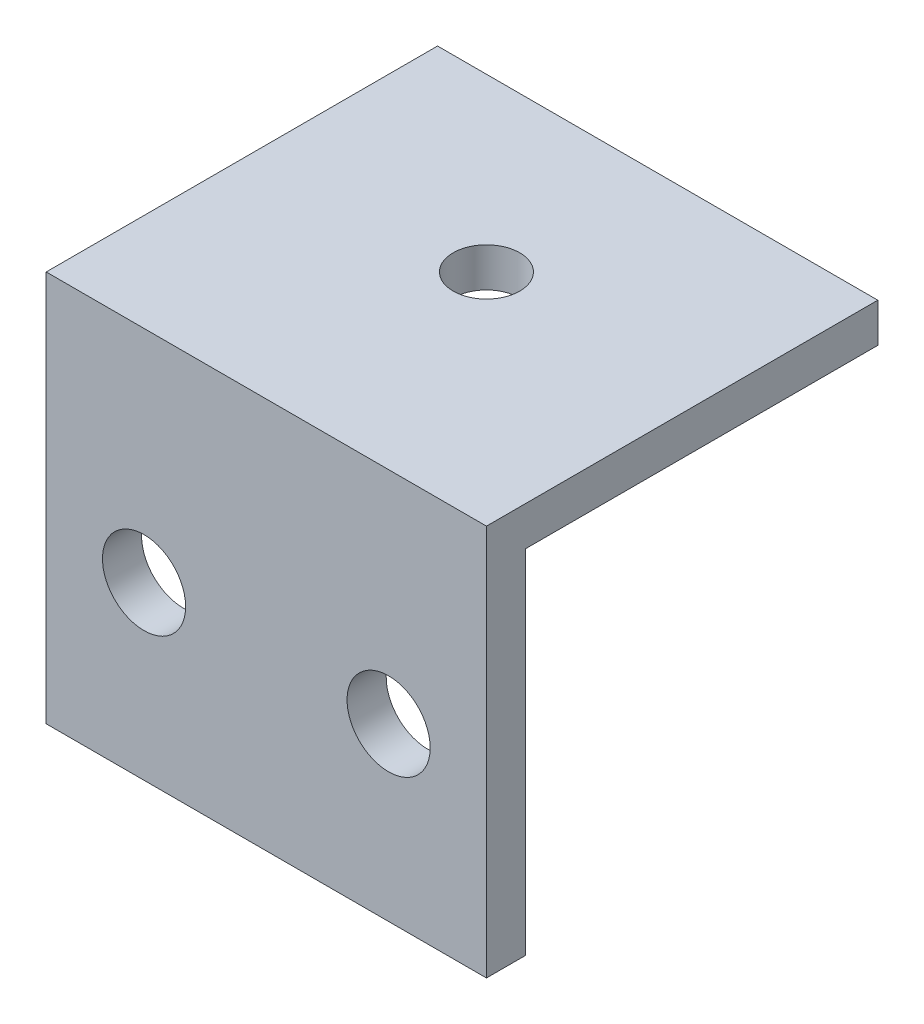
ISO-10303-21;
HEADER;
FILE_DESCRIPTION(('STEP AP214'),'2;1');
FILE_NAME('part.step','',(''),(''),'','','');
FILE_SCHEMA(('AUTOMOTIVE_DESIGN { 1 0 10303 214 1 1 1 1 }'));
ENDSEC;
DATA;
#1=APPLICATION_CONTEXT('core data for automotive mechanical design processes');
#2=APPLICATION_PROTOCOL_DEFINITION('international standard','automotive_design',2000,#1);
#3=PRODUCT_CONTEXT('',#1,'mechanical');
#4=PRODUCT('Part','Part','',(#3));
#5=PRODUCT_RELATED_PRODUCT_CATEGORY('part','',(#4));
#6=PRODUCT_DEFINITION_FORMATION('','',#4);
#7=PRODUCT_DEFINITION_CONTEXT('part definition',#1,'design');
#8=PRODUCT_DEFINITION('design','',#6,#7);
#9=PRODUCT_DEFINITION_SHAPE('','',#8);
#10=(LENGTH_UNIT() NAMED_UNIT(*) SI_UNIT(.MILLI.,.METRE.));
#11=(NAMED_UNIT(*) PLANE_ANGLE_UNIT() SI_UNIT($,.RADIAN.));
#12=(NAMED_UNIT(*) SI_UNIT($,.STERADIAN.) SOLID_ANGLE_UNIT());
#13=UNCERTAINTY_MEASURE_WITH_UNIT(LENGTH_MEASURE(1.E-05),#10,'distance_accuracy_value','');
#14=(GEOMETRIC_REPRESENTATION_CONTEXT(3) GLOBAL_UNCERTAINTY_ASSIGNED_CONTEXT((#13)) GLOBAL_UNIT_ASSIGNED_CONTEXT((#10,
#11,#12)) REPRESENTATION_CONTEXT('',''));
#15=CARTESIAN_POINT('',(0.,0.,0.));
#16=DIRECTION('',(0.,0.,1.));
#17=DIRECTION('',(1.,0.,0.));
#18=AXIS2_PLACEMENT_3D('',#15,#16,#17);
#19=CARTESIAN_POINT('',(22.5,-40.,-4.));
#20=DIRECTION('',(0.,1.,0.));
#21=DIRECTION('',(0.,0.,1.));
#22=AXIS2_PLACEMENT_3D('',#19,#20,#21);
#23=PLANE('',#22);
#24=DIRECTION('',(0.,0.,-1.));
#25=VECTOR('',#24,1.);
#26=CARTESIAN_POINT('',(-22.5,-40.,-4.));
#27=LINE('',#26,#25);
#28=CARTESIAN_POINT('',(-22.5,-40.,0.));
#29=VERTEX_POINT('',#28);
#30=CARTESIAN_POINT('',(-22.5,-40.,-4.));
#31=VERTEX_POINT('',#30);
#32=EDGE_CURVE('E123',#29,#31,#27,.T.);
#33=ORIENTED_EDGE('',*,*,#32,.T.);
#34=DIRECTION('',(-1.,0.,0.));
#35=VECTOR('',#34,1.);
#36=CARTESIAN_POINT('',(22.5,-40.,-4.));
#37=LINE('',#36,#35);
#38=CARTESIAN_POINT('',(22.5,-40.,-4.));
#39=VERTEX_POINT('',#38);
#40=EDGE_CURVE('E11',#39,#31,#37,.T.);
#41=ORIENTED_EDGE('',*,*,#40,.F.);
#42=DIRECTION('',(0.,0.,-1.));
#43=VECTOR('',#42,1.);
#44=CARTESIAN_POINT('',(22.5,-40.,-4.));
#45=LINE('',#44,#43);
#46=CARTESIAN_POINT('',(22.5,-40.,0.));
#47=VERTEX_POINT('',#46);
#48=EDGE_CURVE('E134',#47,#39,#45,.T.);
#49=ORIENTED_EDGE('',*,*,#48,.F.);
#50=DIRECTION('',(-1.,0.,0.));
#51=VECTOR('',#50,1.);
#52=CARTESIAN_POINT('',(22.5,-40.,0.));
#53=LINE('',#52,#51);
#54=EDGE_CURVE('E119',#47,#29,#53,.T.);
#55=ORIENTED_EDGE('',*,*,#54,.T.);
#56=EDGE_LOOP('',(#33,#41,#49,#55));
#57=FACE_BOUND('',#56,.T.);
#58=ADVANCED_FACE('F39',(#57),#23,.F.);
#59=CARTESIAN_POINT('',(22.5,-4.00000000000001,-4.));
#60=DIRECTION('',(0.,0.,1.));
#61=DIRECTION('',(0.,-1.,0.));
#62=AXIS2_PLACEMENT_3D('',#59,#60,#61);
#63=PLANE('',#62);
#64=CARTESIAN_POINT('',(-12.5,-22.5,-4.));
#65=DIRECTION('',(0.,0.,1.));
#66=DIRECTION('',(0.,-1.,0.));
#67=AXIS2_PLACEMENT_3D('',#64,#65,#66);
#68=CIRCLE('',#67,4.24999999999999);
#69=CARTESIAN_POINT('',(-12.5,-26.75,-4.));
#70=VERTEX_POINT('',#69);
#71=EDGE_CURVE('E261',#70,#70,#68,.T.);
#72=ORIENTED_EDGE('',*,*,#71,.T.);
#73=EDGE_LOOP('',(#72));
#74=FACE_BOUND('',#73,.T.);
#75=CARTESIAN_POINT('',(12.5,-22.5,-4.));
#76=DIRECTION('',(0.,0.,1.));
#77=DIRECTION('',(0.,-1.,0.));
#78=AXIS2_PLACEMENT_3D('',#75,#76,#77);
#79=CIRCLE('',#78,4.24999999999999);
#80=CARTESIAN_POINT('',(12.5,-26.75,-4.));
#81=VERTEX_POINT('',#80);
#82=EDGE_CURVE('E265',#81,#81,#79,.T.);
#83=ORIENTED_EDGE('',*,*,#82,.T.);
#84=EDGE_LOOP('',(#83));
#85=FACE_BOUND('',#84,.T.);
#86=DIRECTION('',(0.,1.,0.));
#87=VECTOR('',#86,1.);
#88=CARTESIAN_POINT('',(-22.5,-4.00000000000001,-4.));
#89=LINE('',#88,#87);
#90=CARTESIAN_POINT('',(-22.5,-4.00000000000001,-4.));
#91=VERTEX_POINT('',#90);
#92=EDGE_CURVE('E126',#31,#91,#89,.T.);
#93=ORIENTED_EDGE('',*,*,#92,.T.);
#94=DIRECTION('',(-1.,0.,0.));
#95=VECTOR('',#94,1.);
#96=CARTESIAN_POINT('',(22.5,-4.00000000000001,-4.));
#97=LINE('',#96,#95);
#98=CARTESIAN_POINT('',(22.5,-4.00000000000001,-4.));
#99=VERTEX_POINT('',#98);
#100=EDGE_CURVE('E47',#99,#91,#97,.T.);
#101=ORIENTED_EDGE('',*,*,#100,.F.);
#102=DIRECTION('',(0.,1.,0.));
#103=VECTOR('',#102,1.);
#104=CARTESIAN_POINT('',(22.5,-4.00000000000001,-4.));
#105=LINE('',#104,#103);
#106=EDGE_CURVE('E92',#39,#99,#105,.T.);
#107=ORIENTED_EDGE('',*,*,#106,.F.);
#108=ORIENTED_EDGE('',*,*,#40,.T.);
#109=EDGE_LOOP('',(#93,#101,#107,#108));
#110=FACE_BOUND('',#109,.T.);
#111=ADVANCED_FACE('F162',(#74,#85,#110),#63,.F.);
#112=CARTESIAN_POINT('',(22.5,-4.,-40.));
#113=DIRECTION('',(0.,1.,0.));
#114=DIRECTION('',(0.,0.,1.));
#115=AXIS2_PLACEMENT_3D('',#112,#113,#114);
#116=PLANE('',#115);
#117=CARTESIAN_POINT('',(0.,-4.,-22.5));
#118=DIRECTION('',(0.,1.,0.));
#119=DIRECTION('',(0.,0.,1.));
#120=AXIS2_PLACEMENT_3D('',#117,#118,#119);
#121=CIRCLE('',#120,3.39999999999999);
#122=CARTESIAN_POINT('',(0.,-4.,-19.1));
#123=VERTEX_POINT('',#122);
#124=EDGE_CURVE('E127',#123,#123,#121,.T.);
#125=ORIENTED_EDGE('',*,*,#124,.T.);
#126=EDGE_LOOP('',(#125));
#127=FACE_BOUND('',#126,.T.);
#128=DIRECTION('',(0.,0.,-1.));
#129=VECTOR('',#128,1.);
#130=CARTESIAN_POINT('',(-22.5,-4.,-40.));
#131=LINE('',#130,#129);
#132=CARTESIAN_POINT('',(-22.5,-4.,-40.));
#133=VERTEX_POINT('',#132);
#134=EDGE_CURVE('E129',#91,#133,#131,.T.);
#135=ORIENTED_EDGE('',*,*,#134,.T.);
#136=DIRECTION('',(-1.,0.,0.));
#137=VECTOR('',#136,1.);
#138=CARTESIAN_POINT('',(22.5,-4.,-40.));
#139=LINE('',#138,#137);
#140=CARTESIAN_POINT('',(22.5,-4.,-40.));
#141=VERTEX_POINT('',#140);
#142=EDGE_CURVE('E114',#141,#133,#139,.T.);
#143=ORIENTED_EDGE('',*,*,#142,.F.);
#144=DIRECTION('',(0.,0.,-1.));
#145=VECTOR('',#144,1.);
#146=CARTESIAN_POINT('',(22.5,-4.,-40.));
#147=LINE('',#146,#145);
#148=EDGE_CURVE('E105',#99,#141,#147,.T.);
#149=ORIENTED_EDGE('',*,*,#148,.F.);
#150=ORIENTED_EDGE('',*,*,#100,.T.);
#151=EDGE_LOOP('',(#135,#143,#149,#150));
#152=FACE_BOUND('',#151,.T.);
#153=ADVANCED_FACE('F140',(#127,#152),#116,.F.);
#154=CARTESIAN_POINT('',(22.5,0.,-40.));
#155=DIRECTION('',(0.,0.,1.));
#156=DIRECTION('',(1.,0.,0.));
#157=AXIS2_PLACEMENT_3D('',#154,#155,#156);
#158=PLANE('',#157);
#159=DIRECTION('',(0.,1.,0.));
#160=VECTOR('',#159,1.);
#161=CARTESIAN_POINT('',(-22.5,0.,-40.));
#162=LINE('',#161,#160);
#163=CARTESIAN_POINT('',(-22.5,0.,-40.));
#164=VERTEX_POINT('',#163);
#165=EDGE_CURVE('E113',#133,#164,#162,.T.);
#166=ORIENTED_EDGE('',*,*,#165,.T.);
#167=DIRECTION('',(-1.,0.,0.));
#168=VECTOR('',#167,1.);
#169=CARTESIAN_POINT('',(22.5,0.,-40.));
#170=LINE('',#169,#168);
#171=CARTESIAN_POINT('',(22.5,0.,-40.));
#172=VERTEX_POINT('',#171);
#173=EDGE_CURVE('E110',#172,#164,#170,.T.);
#174=ORIENTED_EDGE('',*,*,#173,.F.);
#175=DIRECTION('',(0.,1.,0.));
#176=VECTOR('',#175,1.);
#177=CARTESIAN_POINT('',(22.5,0.,-40.));
#178=LINE('',#177,#176);
#179=EDGE_CURVE('E99',#141,#172,#178,.T.);
#180=ORIENTED_EDGE('',*,*,#179,.F.);
#181=ORIENTED_EDGE('',*,*,#142,.T.);
#182=EDGE_LOOP('',(#166,#174,#180,#181));
#183=FACE_BOUND('',#182,.T.);
#184=ADVANCED_FACE('F111',(#183),#158,.F.);
#185=CARTESIAN_POINT('',(22.5,0.,0.));
#186=DIRECTION('',(0.,-1.,0.));
#187=DIRECTION('',(0.,0.,-1.));
#188=AXIS2_PLACEMENT_3D('',#185,#186,#187);
#189=PLANE('',#188);
#190=CARTESIAN_POINT('',(0.,0.,-22.5));
#191=DIRECTION('',(0.,1.,0.));
#192=DIRECTION('',(0.,0.,1.));
#193=AXIS2_PLACEMENT_3D('',#190,#191,#192);
#194=CIRCLE('',#193,3.4);
#195=CARTESIAN_POINT('',(0.,0.,-19.1));
#196=VERTEX_POINT('',#195);
#197=EDGE_CURVE('E271',#196,#196,#194,.T.);
#198=ORIENTED_EDGE('',*,*,#197,.F.);
#199=EDGE_LOOP('',(#198));
#200=FACE_BOUND('',#199,.T.);
#201=DIRECTION('',(0.,0.,1.));
#202=VECTOR('',#201,1.);
#203=CARTESIAN_POINT('',(-22.5,0.,0.));
#204=LINE('',#203,#202);
#205=CARTESIAN_POINT('',(-22.5,0.,0.));
#206=VERTEX_POINT('',#205);
#207=EDGE_CURVE('E78',#164,#206,#204,.T.);
#208=ORIENTED_EDGE('',*,*,#207,.T.);
#209=DIRECTION('',(-1.,0.,0.));
#210=VECTOR('',#209,1.);
#211=CARTESIAN_POINT('',(22.5,0.,0.));
#212=LINE('',#211,#210);
#213=CARTESIAN_POINT('',(22.5,0.,0.));
#214=VERTEX_POINT('',#213);
#215=EDGE_CURVE('E115',#214,#206,#212,.T.);
#216=ORIENTED_EDGE('',*,*,#215,.F.);
#217=DIRECTION('',(0.,0.,1.));
#218=VECTOR('',#217,1.);
#219=CARTESIAN_POINT('',(22.5,0.,0.));
#220=LINE('',#219,#218);
#221=EDGE_CURVE('E103',#172,#214,#220,.T.);
#222=ORIENTED_EDGE('',*,*,#221,.F.);
#223=ORIENTED_EDGE('',*,*,#173,.T.);
#224=EDGE_LOOP('',(#208,#216,#222,#223));
#225=FACE_BOUND('',#224,.T.);
#226=ADVANCED_FACE('F117',(#200,#225),#189,.F.);
#227=CARTESIAN_POINT('',(22.5,-40.,0.));
#228=DIRECTION('',(0.,0.,-1.));
#229=DIRECTION('',(-1.,0.,0.));
#230=AXIS2_PLACEMENT_3D('',#227,#228,#229);
#231=PLANE('',#230);
#232=CARTESIAN_POINT('',(-12.5,-22.5,0.));
#233=DIRECTION('',(0.,0.,1.));
#234=DIRECTION('',(1.,0.,0.));
#235=AXIS2_PLACEMENT_3D('',#232,#233,#234);
#236=CIRCLE('',#235,4.25);
#237=CARTESIAN_POINT('',(-8.25,-22.5,0.));
#238=VERTEX_POINT('',#237);
#239=EDGE_CURVE('E259',#238,#238,#236,.T.);
#240=ORIENTED_EDGE('',*,*,#239,.F.);
#241=EDGE_LOOP('',(#240));
#242=FACE_BOUND('',#241,.T.);
#243=CARTESIAN_POINT('',(12.5,-22.5,0.));
#244=DIRECTION('',(0.,0.,1.));
#245=DIRECTION('',(1.,0.,0.));
#246=AXIS2_PLACEMENT_3D('',#243,#244,#245);
#247=CIRCLE('',#246,4.25);
#248=CARTESIAN_POINT('',(16.75,-22.5,0.));
#249=VERTEX_POINT('',#248);
#250=EDGE_CURVE('E262',#249,#249,#247,.T.);
#251=ORIENTED_EDGE('',*,*,#250,.F.);
#252=EDGE_LOOP('',(#251));
#253=FACE_BOUND('',#252,.T.);
#254=DIRECTION('',(0.,-1.,0.));
#255=VECTOR('',#254,1.);
#256=CARTESIAN_POINT('',(-22.5,-40.,0.));
#257=LINE('',#256,#255);
#258=EDGE_CURVE('E84',#206,#29,#257,.T.);
#259=ORIENTED_EDGE('',*,*,#258,.T.);
#260=ORIENTED_EDGE('',*,*,#54,.F.);
#261=DIRECTION('',(0.,-1.,0.));
#262=VECTOR('',#261,1.);
#263=CARTESIAN_POINT('',(22.5,-40.,0.));
#264=LINE('',#263,#262);
#265=EDGE_CURVE('E55',#214,#47,#264,.T.);
#266=ORIENTED_EDGE('',*,*,#265,.F.);
#267=ORIENTED_EDGE('',*,*,#215,.T.);
#268=EDGE_LOOP('',(#259,#260,#266,#267));
#269=FACE_BOUND('',#268,.T.);
#270=ADVANCED_FACE('F147',(#242,#253,#269),#231,.F.);
#271=CARTESIAN_POINT('',(22.5,0.,0.));
#272=DIRECTION('',(-1.,0.,0.));
#273=DIRECTION('',(0.,0.,1.));
#274=AXIS2_PLACEMENT_3D('',#271,#272,#273);
#275=PLANE('',#274);
#276=ORIENTED_EDGE('',*,*,#48,.T.);
#277=ORIENTED_EDGE('',*,*,#106,.T.);
#278=ORIENTED_EDGE('',*,*,#148,.T.);
#279=ORIENTED_EDGE('',*,*,#179,.T.);
#280=ORIENTED_EDGE('',*,*,#221,.T.);
#281=ORIENTED_EDGE('',*,*,#265,.T.);
#282=EDGE_LOOP('',(#276,#277,#278,#279,#280,#281));
#283=FACE_BOUND('',#282,.T.);
#284=ADVANCED_FACE('F101',(#283),#275,.F.);
#285=CARTESIAN_POINT('',(-22.5,0.,0.));
#286=DIRECTION('',(-1.,0.,0.));
#287=DIRECTION('',(0.,0.,1.));
#288=AXIS2_PLACEMENT_3D('',#285,#286,#287);
#289=PLANE('',#288);
#290=ORIENTED_EDGE('',*,*,#32,.F.);
#291=ORIENTED_EDGE('',*,*,#258,.F.);
#292=ORIENTED_EDGE('',*,*,#207,.F.);
#293=ORIENTED_EDGE('',*,*,#165,.F.);
#294=ORIENTED_EDGE('',*,*,#134,.F.);
#295=ORIENTED_EDGE('',*,*,#92,.F.);
#296=EDGE_LOOP('',(#290,#291,#292,#293,#294,#295));
#297=FACE_BOUND('',#296,.T.);
#298=ADVANCED_FACE('F143',(#297),#289,.T.);
#299=CARTESIAN_POINT('',(0.,0.,-22.5));
#300=DIRECTION('',(0.,1.,0.));
#301=DIRECTION('',(0.,0.,1.));
#302=AXIS2_PLACEMENT_3D('',#299,#300,#301);
#303=CYLINDRICAL_SURFACE('',#302,3.39999999999999);
#304=ORIENTED_EDGE('',*,*,#197,.T.);
#305=EDGE_LOOP('',(#304));
#306=FACE_BOUND('',#305,.T.);
#307=ORIENTED_EDGE('',*,*,#124,.F.);
#308=EDGE_LOOP('',(#307));
#309=FACE_BOUND('',#308,.T.);
#310=ADVANCED_FACE('F192',(#306,#309),#303,.F.);
#311=CARTESIAN_POINT('',(12.5,-22.5,0.));
#312=DIRECTION('',(0.,0.,1.));
#313=DIRECTION('',(1.,0.,0.));
#314=AXIS2_PLACEMENT_3D('',#311,#312,#313);
#315=CYLINDRICAL_SURFACE('',#314,4.24999999999999);
#316=ORIENTED_EDGE('',*,*,#250,.T.);
#317=EDGE_LOOP('',(#316));
#318=FACE_BOUND('',#317,.T.);
#319=ORIENTED_EDGE('',*,*,#82,.F.);
#320=EDGE_LOOP('',(#319));
#321=FACE_BOUND('',#320,.T.);
#322=ADVANCED_FACE('F197',(#318,#321),#315,.F.);
#323=CARTESIAN_POINT('',(-12.5,-22.5,0.));
#324=DIRECTION('',(0.,0.,1.));
#325=DIRECTION('',(1.,0.,0.));
#326=AXIS2_PLACEMENT_3D('',#323,#324,#325);
#327=CYLINDRICAL_SURFACE('',#326,4.24999999999999);
#328=ORIENTED_EDGE('',*,*,#239,.T.);
#329=EDGE_LOOP('',(#328));
#330=FACE_BOUND('',#329,.T.);
#331=ORIENTED_EDGE('',*,*,#71,.F.);
#332=EDGE_LOOP('',(#331));
#333=FACE_BOUND('',#332,.T.);
#334=ADVANCED_FACE('F208',(#330,#333),#327,.F.);
#335=CLOSED_SHELL('',(#58,#111,#153,#184,#226,#270,#284,#298,#310,#322,#334));
#336=MANIFOLD_SOLID_BREP('B2',#335);
#337=ADVANCED_BREP_SHAPE_REPRESENTATION('',(#18,#336),#14);
#338=SHAPE_DEFINITION_REPRESENTATION(#9,#337);
ENDSEC;
END-ISO-10303-21;
